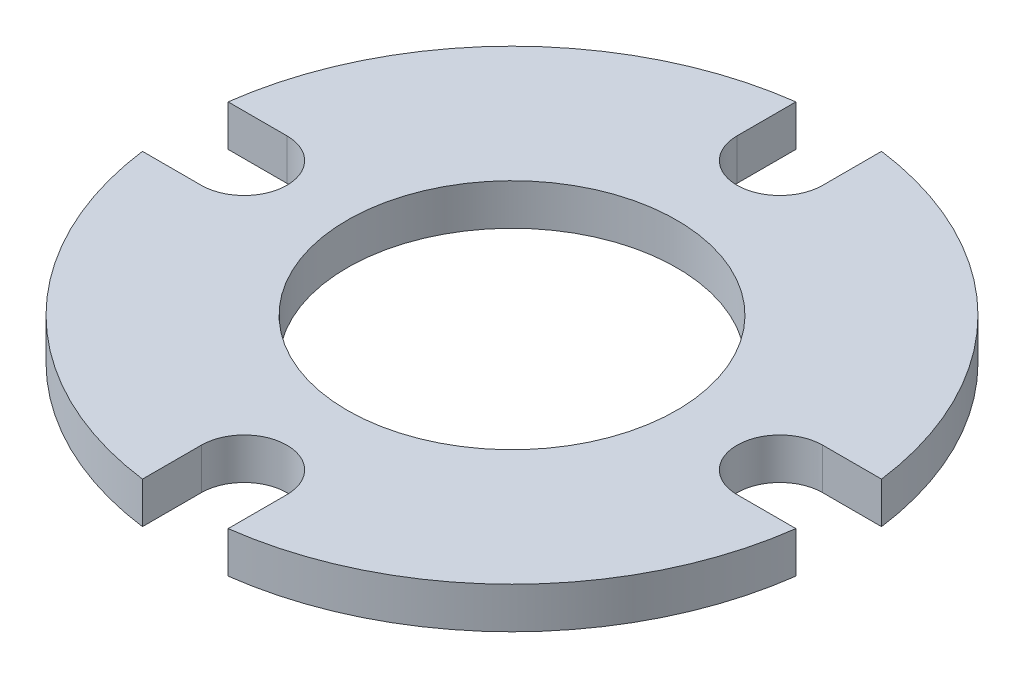
ISO-10303-21;
HEADER;
FILE_DESCRIPTION(('STEP AP214'),'2;1');
FILE_NAME('part.step','',(''),(''),'','','');
FILE_SCHEMA(('AUTOMOTIVE_DESIGN { 1 0 10303 214 1 1 1 1 }'));
ENDSEC;
DATA;
#1=APPLICATION_CONTEXT('core data for automotive mechanical design processes');
#2=APPLICATION_PROTOCOL_DEFINITION('international standard','automotive_design',2000,#1);
#3=PRODUCT_CONTEXT('',#1,'mechanical');
#4=PRODUCT('Part','Part','',(#3));
#5=PRODUCT_RELATED_PRODUCT_CATEGORY('part','',(#4));
#6=PRODUCT_DEFINITION_FORMATION('','',#4);
#7=PRODUCT_DEFINITION_CONTEXT('part definition',#1,'design');
#8=PRODUCT_DEFINITION('design','',#6,#7);
#9=PRODUCT_DEFINITION_SHAPE('','',#8);
#10=(LENGTH_UNIT() NAMED_UNIT(*) SI_UNIT(.MILLI.,.METRE.));
#11=(NAMED_UNIT(*) PLANE_ANGLE_UNIT() SI_UNIT($,.RADIAN.));
#12=(NAMED_UNIT(*) SI_UNIT($,.STERADIAN.) SOLID_ANGLE_UNIT());
#13=UNCERTAINTY_MEASURE_WITH_UNIT(LENGTH_MEASURE(1.E-05),#10,'distance_accuracy_value','');
#14=(GEOMETRIC_REPRESENTATION_CONTEXT(3) GLOBAL_UNCERTAINTY_ASSIGNED_CONTEXT((#13)) GLOBAL_UNIT_ASSIGNED_CONTEXT((#10,
#11,#12)) REPRESENTATION_CONTEXT('',''));
#15=CARTESIAN_POINT('',(0.,0.,0.));
#16=DIRECTION('',(0.,0.,1.));
#17=DIRECTION('',(1.,0.,0.));
#18=AXIS2_PLACEMENT_3D('',#15,#16,#17);
#19=CARTESIAN_POINT('',(0.,0.0625,0.));
#20=DIRECTION('',(0.,1.,0.));
#21=DIRECTION('',(0.,0.,1.));
#22=AXIS2_PLACEMENT_3D('',#19,#20,#21);
#23=PLANE('',#22);
#24=DIRECTION('',(0.,0.,-1.));
#25=VECTOR('',#24,1.);
#26=CARTESIAN_POINT('',(-0.129999999999991,0.0625,-0.813000000000001));
#27=LINE('',#26,#25);
#28=CARTESIAN_POINT('',(-0.129999999999991,0.0625,-0.813000000000001));
#29=VERTEX_POINT('',#28);
#30=CARTESIAN_POINT('',(-0.129999999999989,0.0625,-0.991513993849811));
#31=VERTEX_POINT('',#30);
#32=EDGE_CURVE('E277',#29,#31,#27,.T.);
#33=ORIENTED_EDGE('',*,*,#32,.T.);
#34=CARTESIAN_POINT('',(0.,0.0625,0.));
#35=DIRECTION('',(0.,1.,0.));
#36=DIRECTION('',(0.,0.,1.));
#37=AXIS2_PLACEMENT_3D('',#34,#35,#36);
#38=CIRCLE('',#37,1.);
#39=CARTESIAN_POINT('',(-0.991513993849809,0.0625,-0.130000000000008));
#40=VERTEX_POINT('',#39);
#41=EDGE_CURVE('E167',#31,#40,#38,.T.);
#42=ORIENTED_EDGE('',*,*,#41,.T.);
#43=DIRECTION('',(-1.,0.,0.));
#44=VECTOR('',#43,1.);
#45=CARTESIAN_POINT('',(-0.812999999999999,0.0625,-0.130000000000006));
#46=LINE('',#45,#44);
#47=CARTESIAN_POINT('',(-0.812999999999999,0.0625,-0.130000000000006));
#48=VERTEX_POINT('',#47);
#49=EDGE_CURVE('E307',#48,#40,#46,.T.);
#50=ORIENTED_EDGE('',*,*,#49,.F.);
#51=CARTESIAN_POINT('',(-0.813,0.0625,0.));
#52=DIRECTION('',(0.,1.,0.));
#53=DIRECTION('',(0.,0.,1.));
#54=AXIS2_PLACEMENT_3D('',#51,#52,#53);
#55=CIRCLE('',#54,0.13);
#56=CARTESIAN_POINT('',(-0.813000000000001,0.0625,0.129999999999994));
#57=VERTEX_POINT('',#56);
#58=EDGE_CURVE('E321',#57,#48,#55,.T.);
#59=ORIENTED_EDGE('',*,*,#58,.F.);
#60=DIRECTION('',(-1.,0.,0.));
#61=VECTOR('',#60,1.);
#62=CARTESIAN_POINT('',(-0.813000000000001,0.0625,0.129999999999994));
#63=LINE('',#62,#61);
#64=CARTESIAN_POINT('',(-0.99151399384981,0.0625,0.129999999999993));
#65=VERTEX_POINT('',#64);
#66=EDGE_CURVE('E323',#57,#65,#63,.T.);
#67=ORIENTED_EDGE('',*,*,#66,.T.);
#68=CARTESIAN_POINT('',(0.,0.0625,0.));
#69=DIRECTION('',(0.,1.,0.));
#70=DIRECTION('',(0.,0.,1.));
#71=AXIS2_PLACEMENT_3D('',#68,#69,#70);
#72=CIRCLE('',#71,1.);
#73=CARTESIAN_POINT('',(-0.130000000000004,0.0625,0.991513993849809));
#74=VERTEX_POINT('',#73);
#75=EDGE_CURVE('E329',#65,#74,#72,.T.);
#76=ORIENTED_EDGE('',*,*,#75,.T.);
#77=DIRECTION('',(0.,0.,1.));
#78=VECTOR('',#77,1.);
#79=CARTESIAN_POINT('',(-0.130000000000003,0.0625,0.813));
#80=LINE('',#79,#78);
#81=CARTESIAN_POINT('',(-0.130000000000003,0.0625,0.813));
#82=VERTEX_POINT('',#81);
#83=EDGE_CURVE('E331',#82,#74,#80,.T.);
#84=ORIENTED_EDGE('',*,*,#83,.F.);
#85=CARTESIAN_POINT('',(0.,0.0625,0.813));
#86=DIRECTION('',(0.,1.,0.));
#87=DIRECTION('',(0.,0.,1.));
#88=AXIS2_PLACEMENT_3D('',#85,#86,#87);
#89=CIRCLE('',#88,0.13);
#90=CARTESIAN_POINT('',(0.129999999999997,0.0625,0.813000000000001));
#91=VERTEX_POINT('',#90);
#92=EDGE_CURVE('E334',#91,#82,#89,.T.);
#93=ORIENTED_EDGE('',*,*,#92,.F.);
#94=DIRECTION('',(0.,0.,1.));
#95=VECTOR('',#94,1.);
#96=CARTESIAN_POINT('',(0.129999999999997,0.0625,0.813000000000001));
#97=LINE('',#96,#95);
#98=CARTESIAN_POINT('',(0.129999999999996,0.0625,0.99151399384981));
#99=VERTEX_POINT('',#98);
#100=EDGE_CURVE('E337',#91,#99,#97,.T.);
#101=ORIENTED_EDGE('',*,*,#100,.T.);
#102=CARTESIAN_POINT('',(0.,0.0625,0.));
#103=DIRECTION('',(0.,1.,0.));
#104=DIRECTION('',(0.,0.,1.));
#105=AXIS2_PLACEMENT_3D('',#102,#103,#104);
#106=CIRCLE('',#105,1.);
#107=CARTESIAN_POINT('',(0.991513993849809,0.0625,0.13));
#108=VERTEX_POINT('',#107);
#109=EDGE_CURVE('E339',#99,#108,#106,.T.);
#110=ORIENTED_EDGE('',*,*,#109,.T.);
#111=DIRECTION('',(1.,0.,0.));
#112=VECTOR('',#111,1.);
#113=CARTESIAN_POINT('',(0.813,0.0625,0.13));
#114=LINE('',#113,#112);
#115=CARTESIAN_POINT('',(0.813,0.0625,0.13));
#116=VERTEX_POINT('',#115);
#117=EDGE_CURVE('E341',#116,#108,#114,.T.);
#118=ORIENTED_EDGE('',*,*,#117,.F.);
#119=CARTESIAN_POINT('',(0.813,0.0625,0.));
#120=DIRECTION('',(0.,1.,0.));
#121=DIRECTION('',(0.,0.,1.));
#122=AXIS2_PLACEMENT_3D('',#119,#120,#121);
#123=CIRCLE('',#122,0.13);
#124=CARTESIAN_POINT('',(0.813,0.0625,-0.13));
#125=VERTEX_POINT('',#124);
#126=EDGE_CURVE('E344',#125,#116,#123,.T.);
#127=ORIENTED_EDGE('',*,*,#126,.F.);
#128=DIRECTION('',(1.,0.,0.));
#129=VECTOR('',#128,1.);
#130=CARTESIAN_POINT('',(0.813,0.0625,-0.13));
#131=LINE('',#130,#129);
#132=CARTESIAN_POINT('',(0.991513993849809,0.0625,-0.13));
#133=VERTEX_POINT('',#132);
#134=EDGE_CURVE('E215',#125,#133,#131,.T.);
#135=ORIENTED_EDGE('',*,*,#134,.T.);
#136=CARTESIAN_POINT('',(0.,0.0625,0.));
#137=DIRECTION('',(0.,1.,0.));
#138=DIRECTION('',(0.,0.,1.));
#139=AXIS2_PLACEMENT_3D('',#136,#137,#138);
#140=CIRCLE('',#139,1.);
#141=CARTESIAN_POINT('',(0.130000000000011,0.0625,-0.991513993849808));
#142=VERTEX_POINT('',#141);
#143=EDGE_CURVE('E207',#133,#142,#140,.T.);
#144=ORIENTED_EDGE('',*,*,#143,.T.);
#145=DIRECTION('',(0.,0.,-1.));
#146=VECTOR('',#145,1.);
#147=CARTESIAN_POINT('',(0.130000000000009,0.0625,-0.812999999999999));
#148=LINE('',#147,#146);
#149=CARTESIAN_POINT('',(0.130000000000009,0.0625,-0.812999999999999));
#150=VERTEX_POINT('',#149);
#151=EDGE_CURVE('E212',#150,#142,#148,.T.);
#152=ORIENTED_EDGE('',*,*,#151,.F.);
#153=CARTESIAN_POINT('',(0.,0.0625,-0.813));
#154=DIRECTION('',(0.,1.,0.));
#155=DIRECTION('',(0.,0.,1.));
#156=AXIS2_PLACEMENT_3D('',#153,#154,#155);
#157=CIRCLE('',#156,0.13);
#158=EDGE_CURVE('E230',#29,#150,#157,.T.);
#159=ORIENTED_EDGE('',*,*,#158,.F.);
#160=EDGE_LOOP('',(#33,#42,#50,#59,#67,#76,#84,#93,#101,#110,#118,#127,#135,#144,#152,#159));
#161=FACE_BOUND('',#160,.T.);
#162=CARTESIAN_POINT('',(0.,0.0625,0.));
#163=DIRECTION('',(0.,1.,0.));
#164=DIRECTION('',(0.,0.,1.));
#165=AXIS2_PLACEMENT_3D('',#162,#163,#164);
#166=CIRCLE('',#165,0.5);
#167=CARTESIAN_POINT('',(0.,0.0625,0.5));
#168=VERTEX_POINT('',#167);
#169=EDGE_CURVE('E238',#168,#168,#166,.T.);
#170=ORIENTED_EDGE('',*,*,#169,.F.);
#171=EDGE_LOOP('',(#170));
#172=FACE_BOUND('',#171,.T.);
#173=ADVANCED_FACE('F88',(#161,#172),#23,.T.);
#174=CARTESIAN_POINT('',(0.,-0.0625,0.));
#175=DIRECTION('',(0.,1.,0.));
#176=DIRECTION('',(0.,0.,1.));
#177=AXIS2_PLACEMENT_3D('',#174,#175,#176);
#178=PLANE('',#177);
#179=DIRECTION('',(0.,0.,-1.));
#180=VECTOR('',#179,1.);
#181=CARTESIAN_POINT('',(-0.129999999999991,-0.0625,-0.813000000000001));
#182=LINE('',#181,#180);
#183=CARTESIAN_POINT('',(-0.129999999999991,-0.0625,-0.813000000000001));
#184=VERTEX_POINT('',#183);
#185=CARTESIAN_POINT('',(-0.129999999999989,-0.0625,-0.991513993849811));
#186=VERTEX_POINT('',#185);
#187=EDGE_CURVE('E235',#184,#186,#182,.T.);
#188=ORIENTED_EDGE('',*,*,#187,.F.);
#189=CARTESIAN_POINT('',(0.,-0.0625,-0.813));
#190=DIRECTION('',(0.,1.,0.));
#191=DIRECTION('',(0.,0.,1.));
#192=AXIS2_PLACEMENT_3D('',#189,#190,#191);
#193=CIRCLE('',#192,0.13);
#194=CARTESIAN_POINT('',(0.130000000000009,-0.0625,-0.812999999999999));
#195=VERTEX_POINT('',#194);
#196=EDGE_CURVE('E274',#184,#195,#193,.T.);
#197=ORIENTED_EDGE('',*,*,#196,.T.);
#198=DIRECTION('',(0.,0.,-1.));
#199=VECTOR('',#198,1.);
#200=CARTESIAN_POINT('',(0.130000000000009,-0.0625,-0.812999999999999));
#201=LINE('',#200,#199);
#202=CARTESIAN_POINT('',(0.130000000000011,-0.0625,-0.991513993849808));
#203=VERTEX_POINT('',#202);
#204=EDGE_CURVE('E272',#195,#203,#201,.T.);
#205=ORIENTED_EDGE('',*,*,#204,.T.);
#206=CARTESIAN_POINT('',(0.,-0.0625,0.));
#207=DIRECTION('',(0.,1.,0.));
#208=DIRECTION('',(0.,0.,1.));
#209=AXIS2_PLACEMENT_3D('',#206,#207,#208);
#210=CIRCLE('',#209,1.);
#211=CARTESIAN_POINT('',(0.991513993849809,-0.0625,-0.13));
#212=VERTEX_POINT('',#211);
#213=EDGE_CURVE('E224',#212,#203,#210,.T.);
#214=ORIENTED_EDGE('',*,*,#213,.F.);
#215=DIRECTION('',(1.,0.,0.));
#216=VECTOR('',#215,1.);
#217=CARTESIAN_POINT('',(0.813,-0.0625,-0.13));
#218=LINE('',#217,#216);
#219=CARTESIAN_POINT('',(0.813,-0.0625,-0.13));
#220=VERTEX_POINT('',#219);
#221=EDGE_CURVE('E269',#220,#212,#218,.T.);
#222=ORIENTED_EDGE('',*,*,#221,.F.);
#223=CARTESIAN_POINT('',(0.813,-0.0625,0.));
#224=DIRECTION('',(0.,1.,0.));
#225=DIRECTION('',(0.,0.,1.));
#226=AXIS2_PLACEMENT_3D('',#223,#224,#225);
#227=CIRCLE('',#226,0.13);
#228=CARTESIAN_POINT('',(0.813,-0.0625,0.13));
#229=VERTEX_POINT('',#228);
#230=EDGE_CURVE('E266',#220,#229,#227,.T.);
#231=ORIENTED_EDGE('',*,*,#230,.T.);
#232=DIRECTION('',(1.,0.,0.));
#233=VECTOR('',#232,1.);
#234=CARTESIAN_POINT('',(0.813,-0.0625,0.13));
#235=LINE('',#234,#233);
#236=CARTESIAN_POINT('',(0.991513993849809,-0.0625,0.13));
#237=VERTEX_POINT('',#236);
#238=EDGE_CURVE('E263',#229,#237,#235,.T.);
#239=ORIENTED_EDGE('',*,*,#238,.T.);
#240=CARTESIAN_POINT('',(0.,-0.0625,0.));
#241=DIRECTION('',(0.,1.,0.));
#242=DIRECTION('',(0.,0.,1.));
#243=AXIS2_PLACEMENT_3D('',#240,#241,#242);
#244=CIRCLE('',#243,1.);
#245=CARTESIAN_POINT('',(0.129999999999996,-0.0625,0.99151399384981));
#246=VERTEX_POINT('',#245);
#247=EDGE_CURVE('E260',#246,#237,#244,.T.);
#248=ORIENTED_EDGE('',*,*,#247,.F.);
#249=DIRECTION('',(0.,0.,1.));
#250=VECTOR('',#249,1.);
#251=CARTESIAN_POINT('',(0.129999999999997,-0.0625,0.813000000000001));
#252=LINE('',#251,#250);
#253=CARTESIAN_POINT('',(0.129999999999997,-0.0625,0.813000000000001));
#254=VERTEX_POINT('',#253);
#255=EDGE_CURVE('E258',#254,#246,#252,.T.);
#256=ORIENTED_EDGE('',*,*,#255,.F.);
#257=CARTESIAN_POINT('',(0.,-0.0625,0.813));
#258=DIRECTION('',(0.,1.,0.));
#259=DIRECTION('',(0.,0.,1.));
#260=AXIS2_PLACEMENT_3D('',#257,#258,#259);
#261=CIRCLE('',#260,0.13);
#262=CARTESIAN_POINT('',(-0.130000000000003,-0.0625,0.813));
#263=VERTEX_POINT('',#262);
#264=EDGE_CURVE('E255',#254,#263,#261,.T.);
#265=ORIENTED_EDGE('',*,*,#264,.T.);
#266=DIRECTION('',(0.,0.,1.));
#267=VECTOR('',#266,1.);
#268=CARTESIAN_POINT('',(-0.130000000000003,-0.0625,0.813));
#269=LINE('',#268,#267);
#270=CARTESIAN_POINT('',(-0.130000000000004,-0.0625,0.991513993849809));
#271=VERTEX_POINT('',#270);
#272=EDGE_CURVE('E252',#263,#271,#269,.T.);
#273=ORIENTED_EDGE('',*,*,#272,.T.);
#274=CARTESIAN_POINT('',(0.,-0.0625,0.));
#275=DIRECTION('',(0.,1.,0.));
#276=DIRECTION('',(0.,0.,1.));
#277=AXIS2_PLACEMENT_3D('',#274,#275,#276);
#278=CIRCLE('',#277,1.);
#279=CARTESIAN_POINT('',(-0.99151399384981,-0.0625,0.129999999999993));
#280=VERTEX_POINT('',#279);
#281=EDGE_CURVE('E249',#280,#271,#278,.T.);
#282=ORIENTED_EDGE('',*,*,#281,.F.);
#283=DIRECTION('',(-1.,0.,0.));
#284=VECTOR('',#283,1.);
#285=CARTESIAN_POINT('',(-0.813000000000001,-0.0625,0.129999999999994));
#286=LINE('',#285,#284);
#287=CARTESIAN_POINT('',(-0.813000000000001,-0.0625,0.129999999999994));
#288=VERTEX_POINT('',#287);
#289=EDGE_CURVE('E247',#288,#280,#286,.T.);
#290=ORIENTED_EDGE('',*,*,#289,.F.);
#291=CARTESIAN_POINT('',(-0.813,-0.0625,0.));
#292=DIRECTION('',(0.,1.,0.));
#293=DIRECTION('',(0.,0.,1.));
#294=AXIS2_PLACEMENT_3D('',#291,#292,#293);
#295=CIRCLE('',#294,0.13);
#296=CARTESIAN_POINT('',(-0.812999999999999,-0.0625,-0.130000000000006));
#297=VERTEX_POINT('',#296);
#298=EDGE_CURVE('E244',#288,#297,#295,.T.);
#299=ORIENTED_EDGE('',*,*,#298,.T.);
#300=DIRECTION('',(-1.,0.,0.));
#301=VECTOR('',#300,1.);
#302=CARTESIAN_POINT('',(-0.812999999999999,-0.0625,-0.130000000000006));
#303=LINE('',#302,#301);
#304=CARTESIAN_POINT('',(-0.991513993849809,-0.0625,-0.130000000000008));
#305=VERTEX_POINT('',#304);
#306=EDGE_CURVE('E241',#297,#305,#303,.T.);
#307=ORIENTED_EDGE('',*,*,#306,.T.);
#308=CARTESIAN_POINT('',(0.,-0.0625,0.));
#309=DIRECTION('',(0.,1.,0.));
#310=DIRECTION('',(0.,0.,1.));
#311=AXIS2_PLACEMENT_3D('',#308,#309,#310);
#312=CIRCLE('',#311,1.);
#313=EDGE_CURVE('E237',#186,#305,#312,.T.);
#314=ORIENTED_EDGE('',*,*,#313,.F.);
#315=EDGE_LOOP('',(#188,#197,#205,#214,#222,#231,#239,#248,#256,#265,#273,#282,#290,#299,#307,#314));
#316=FACE_BOUND('',#315,.T.);
#317=CARTESIAN_POINT('',(0.,-0.0625,0.));
#318=DIRECTION('',(0.,1.,0.));
#319=DIRECTION('',(0.,0.,1.));
#320=AXIS2_PLACEMENT_3D('',#317,#318,#319);
#321=CIRCLE('',#320,0.5);
#322=CARTESIAN_POINT('',(0.,-0.0625,0.5));
#323=VERTEX_POINT('',#322);
#324=EDGE_CURVE('E563',#323,#323,#321,.T.);
#325=ORIENTED_EDGE('',*,*,#324,.T.);
#326=EDGE_LOOP('',(#325));
#327=FACE_BOUND('',#326,.T.);
#328=ADVANCED_FACE('F311',(#316,#327),#178,.F.);
#329=CARTESIAN_POINT('',(-0.129999999999991,0.0625,-0.813000000000001));
#330=DIRECTION('',(-1.,0.,0.));
#331=DIRECTION('',(0.,0.,1.));
#332=AXIS2_PLACEMENT_3D('',#329,#330,#331);
#333=PLANE('',#332);
#334=ORIENTED_EDGE('',*,*,#187,.T.);
#335=DIRECTION('',(0.,-1.,0.));
#336=VECTOR('',#335,1.);
#337=CARTESIAN_POINT('',(-0.129999999999989,0.0625,-0.991513993849811));
#338=LINE('',#337,#336);
#339=EDGE_CURVE('E12',#31,#186,#338,.T.);
#340=ORIENTED_EDGE('',*,*,#339,.F.);
#341=ORIENTED_EDGE('',*,*,#32,.F.);
#342=DIRECTION('',(0.,-1.,0.));
#343=VECTOR('',#342,1.);
#344=CARTESIAN_POINT('',(-0.129999999999991,0.0625,-0.813000000000001));
#345=LINE('',#344,#343);
#346=EDGE_CURVE('E105',#29,#184,#345,.T.);
#347=ORIENTED_EDGE('',*,*,#346,.T.);
#348=EDGE_LOOP('',(#334,#340,#341,#347));
#349=FACE_BOUND('',#348,.T.);
#350=ADVANCED_FACE('F90',(#349),#333,.F.);
#351=CARTESIAN_POINT('',(0.,0.0625,0.));
#352=DIRECTION('',(0.,-1.,0.));
#353=DIRECTION('',(0.,0.,-1.));
#354=AXIS2_PLACEMENT_3D('',#351,#352,#353);
#355=CYLINDRICAL_SURFACE('',#354,1.);
#356=ORIENTED_EDGE('',*,*,#313,.T.);
#357=DIRECTION('',(0.,-1.,0.));
#358=VECTOR('',#357,1.);
#359=CARTESIAN_POINT('',(-0.991513993849809,0.0625,-0.130000000000008));
#360=LINE('',#359,#358);
#361=EDGE_CURVE('E97',#40,#305,#360,.T.);
#362=ORIENTED_EDGE('',*,*,#361,.F.);
#363=ORIENTED_EDGE('',*,*,#41,.F.);
#364=ORIENTED_EDGE('',*,*,#339,.T.);
#365=EDGE_LOOP('',(#356,#362,#363,#364));
#366=FACE_BOUND('',#365,.T.);
#367=ADVANCED_FACE('F308',(#366),#355,.T.);
#368=CARTESIAN_POINT('',(-0.812999999999999,0.0625,-0.130000000000006));
#369=DIRECTION('',(0.,0.,1.));
#370=DIRECTION('',(1.,0.,0.));
#371=AXIS2_PLACEMENT_3D('',#368,#369,#370);
#372=PLANE('',#371);
#373=ORIENTED_EDGE('',*,*,#306,.F.);
#374=DIRECTION('',(0.,-1.,0.));
#375=VECTOR('',#374,1.);
#376=CARTESIAN_POINT('',(-0.812999999999999,0.0625,-0.130000000000006));
#377=LINE('',#376,#375);
#378=EDGE_CURVE('E301',#48,#297,#377,.T.);
#379=ORIENTED_EDGE('',*,*,#378,.F.);
#380=ORIENTED_EDGE('',*,*,#49,.T.);
#381=ORIENTED_EDGE('',*,*,#361,.T.);
#382=EDGE_LOOP('',(#373,#379,#380,#381));
#383=FACE_BOUND('',#382,.T.);
#384=ADVANCED_FACE('F305',(#383),#372,.T.);
#385=CARTESIAN_POINT('',(-0.813,0.0625,0.));
#386=DIRECTION('',(0.,-1.,0.));
#387=DIRECTION('',(0.,0.,-1.));
#388=AXIS2_PLACEMENT_3D('',#385,#386,#387);
#389=CYLINDRICAL_SURFACE('',#388,0.13);
#390=ORIENTED_EDGE('',*,*,#298,.F.);
#391=DIRECTION('',(0.,-1.,0.));
#392=VECTOR('',#391,1.);
#393=CARTESIAN_POINT('',(-0.813000000000001,0.0625,0.129999999999994));
#394=LINE('',#393,#392);
#395=EDGE_CURVE('E299',#57,#288,#394,.T.);
#396=ORIENTED_EDGE('',*,*,#395,.F.);
#397=ORIENTED_EDGE('',*,*,#58,.T.);
#398=ORIENTED_EDGE('',*,*,#378,.T.);
#399=EDGE_LOOP('',(#390,#396,#397,#398));
#400=FACE_BOUND('',#399,.T.);
#401=ADVANCED_FACE('F317',(#400),#389,.F.);
#402=CARTESIAN_POINT('',(-0.813000000000001,0.0625,0.129999999999994));
#403=DIRECTION('',(0.,0.,1.));
#404=DIRECTION('',(1.,0.,0.));
#405=AXIS2_PLACEMENT_3D('',#402,#403,#404);
#406=PLANE('',#405);
#407=ORIENTED_EDGE('',*,*,#289,.T.);
#408=DIRECTION('',(0.,-1.,0.));
#409=VECTOR('',#408,1.);
#410=CARTESIAN_POINT('',(-0.99151399384981,0.0625,0.129999999999993));
#411=LINE('',#410,#409);
#412=EDGE_CURVE('E296',#65,#280,#411,.T.);
#413=ORIENTED_EDGE('',*,*,#412,.F.);
#414=ORIENTED_EDGE('',*,*,#66,.F.);
#415=ORIENTED_EDGE('',*,*,#395,.T.);
#416=EDGE_LOOP('',(#407,#413,#414,#415));
#417=FACE_BOUND('',#416,.T.);
#418=ADVANCED_FACE('F488',(#417),#406,.F.);
#419=CARTESIAN_POINT('',(0.,0.0625,0.));
#420=DIRECTION('',(0.,-1.,0.));
#421=DIRECTION('',(0.,0.,-1.));
#422=AXIS2_PLACEMENT_3D('',#419,#420,#421);
#423=CYLINDRICAL_SURFACE('',#422,1.);
#424=ORIENTED_EDGE('',*,*,#281,.T.);
#425=DIRECTION('',(0.,-1.,0.));
#426=VECTOR('',#425,1.);
#427=CARTESIAN_POINT('',(-0.130000000000004,0.0625,0.991513993849809));
#428=LINE('',#427,#426);
#429=EDGE_CURVE('E294',#74,#271,#428,.T.);
#430=ORIENTED_EDGE('',*,*,#429,.F.);
#431=ORIENTED_EDGE('',*,*,#75,.F.);
#432=ORIENTED_EDGE('',*,*,#412,.T.);
#433=EDGE_LOOP('',(#424,#430,#431,#432));
#434=FACE_BOUND('',#433,.T.);
#435=ADVANCED_FACE('F477',(#434),#423,.T.);
#436=CARTESIAN_POINT('',(-0.130000000000003,0.0625,0.813));
#437=DIRECTION('',(1.,0.,0.));
#438=DIRECTION('',(0.,0.,-1.));
#439=AXIS2_PLACEMENT_3D('',#436,#437,#438);
#440=PLANE('',#439);
#441=ORIENTED_EDGE('',*,*,#272,.F.);
#442=DIRECTION('',(0.,-1.,0.));
#443=VECTOR('',#442,1.);
#444=CARTESIAN_POINT('',(-0.130000000000003,0.0625,0.813));
#445=LINE('',#444,#443);
#446=EDGE_CURVE('E292',#82,#263,#445,.T.);
#447=ORIENTED_EDGE('',*,*,#446,.F.);
#448=ORIENTED_EDGE('',*,*,#83,.T.);
#449=ORIENTED_EDGE('',*,*,#429,.T.);
#450=EDGE_LOOP('',(#441,#447,#448,#449));
#451=FACE_BOUND('',#450,.T.);
#452=ADVANCED_FACE('F466',(#451),#440,.T.);
#453=CARTESIAN_POINT('',(0.,0.0625,0.813));
#454=DIRECTION('',(0.,-1.,0.));
#455=DIRECTION('',(0.,0.,-1.));
#456=AXIS2_PLACEMENT_3D('',#453,#454,#455);
#457=CYLINDRICAL_SURFACE('',#456,0.13);
#458=ORIENTED_EDGE('',*,*,#264,.F.);
#459=DIRECTION('',(0.,-1.,0.));
#460=VECTOR('',#459,1.);
#461=CARTESIAN_POINT('',(0.129999999999997,0.0625,0.813000000000001));
#462=LINE('',#461,#460);
#463=EDGE_CURVE('E290',#91,#254,#462,.T.);
#464=ORIENTED_EDGE('',*,*,#463,.F.);
#465=ORIENTED_EDGE('',*,*,#92,.T.);
#466=ORIENTED_EDGE('',*,*,#446,.T.);
#467=EDGE_LOOP('',(#458,#464,#465,#466));
#468=FACE_BOUND('',#467,.T.);
#469=ADVANCED_FACE('F455',(#468),#457,.F.);
#470=CARTESIAN_POINT('',(0.129999999999997,0.0625,0.813000000000001));
#471=DIRECTION('',(1.,0.,0.));
#472=DIRECTION('',(0.,0.,-1.));
#473=AXIS2_PLACEMENT_3D('',#470,#471,#472);
#474=PLANE('',#473);
#475=ORIENTED_EDGE('',*,*,#255,.T.);
#476=DIRECTION('',(0.,-1.,0.));
#477=VECTOR('',#476,1.);
#478=CARTESIAN_POINT('',(0.129999999999996,0.0625,0.99151399384981));
#479=LINE('',#478,#477);
#480=EDGE_CURVE('E287',#99,#246,#479,.T.);
#481=ORIENTED_EDGE('',*,*,#480,.F.);
#482=ORIENTED_EDGE('',*,*,#100,.F.);
#483=ORIENTED_EDGE('',*,*,#463,.T.);
#484=EDGE_LOOP('',(#475,#481,#482,#483));
#485=FACE_BOUND('',#484,.T.);
#486=ADVANCED_FACE('F444',(#485),#474,.F.);
#487=CARTESIAN_POINT('',(0.,0.0625,0.));
#488=DIRECTION('',(0.,-1.,0.));
#489=DIRECTION('',(0.,0.,-1.));
#490=AXIS2_PLACEMENT_3D('',#487,#488,#489);
#491=CYLINDRICAL_SURFACE('',#490,1.);
#492=ORIENTED_EDGE('',*,*,#247,.T.);
#493=DIRECTION('',(0.,-1.,0.));
#494=VECTOR('',#493,1.);
#495=CARTESIAN_POINT('',(0.991513993849809,0.0625,0.13));
#496=LINE('',#495,#494);
#497=EDGE_CURVE('E285',#108,#237,#496,.T.);
#498=ORIENTED_EDGE('',*,*,#497,.F.);
#499=ORIENTED_EDGE('',*,*,#109,.F.);
#500=ORIENTED_EDGE('',*,*,#480,.T.);
#501=EDGE_LOOP('',(#492,#498,#499,#500));
#502=FACE_BOUND('',#501,.T.);
#503=ADVANCED_FACE('F434',(#502),#491,.T.);
#504=CARTESIAN_POINT('',(0.813,0.0625,0.13));
#505=DIRECTION('',(0.,0.,-1.));
#506=DIRECTION('',(-1.,0.,0.));
#507=AXIS2_PLACEMENT_3D('',#504,#505,#506);
#508=PLANE('',#507);
#509=ORIENTED_EDGE('',*,*,#238,.F.);
#510=DIRECTION('',(0.,-1.,0.));
#511=VECTOR('',#510,1.);
#512=CARTESIAN_POINT('',(0.813,0.0625,0.13));
#513=LINE('',#512,#511);
#514=EDGE_CURVE('E283',#116,#229,#513,.T.);
#515=ORIENTED_EDGE('',*,*,#514,.F.);
#516=ORIENTED_EDGE('',*,*,#117,.T.);
#517=ORIENTED_EDGE('',*,*,#497,.T.);
#518=EDGE_LOOP('',(#509,#515,#516,#517));
#519=FACE_BOUND('',#518,.T.);
#520=ADVANCED_FACE('F354',(#519),#508,.T.);
#521=CARTESIAN_POINT('',(0.813,0.0625,0.));
#522=DIRECTION('',(0.,-1.,0.));
#523=DIRECTION('',(0.,0.,-1.));
#524=AXIS2_PLACEMENT_3D('',#521,#522,#523);
#525=CYLINDRICAL_SURFACE('',#524,0.13);
#526=ORIENTED_EDGE('',*,*,#230,.F.);
#527=DIRECTION('',(0.,-1.,0.));
#528=VECTOR('',#527,1.);
#529=CARTESIAN_POINT('',(0.813,0.0625,-0.13));
#530=LINE('',#529,#528);
#531=EDGE_CURVE('E281',#125,#220,#530,.T.);
#532=ORIENTED_EDGE('',*,*,#531,.F.);
#533=ORIENTED_EDGE('',*,*,#126,.T.);
#534=ORIENTED_EDGE('',*,*,#514,.T.);
#535=EDGE_LOOP('',(#526,#532,#533,#534));
#536=FACE_BOUND('',#535,.T.);
#537=ADVANCED_FACE('F348',(#536),#525,.F.);
#538=CARTESIAN_POINT('',(0.813,0.0625,-0.13));
#539=DIRECTION('',(0.,0.,-1.));
#540=DIRECTION('',(-1.,0.,0.));
#541=AXIS2_PLACEMENT_3D('',#538,#539,#540);
#542=PLANE('',#541);
#543=ORIENTED_EDGE('',*,*,#221,.T.);
#544=DIRECTION('',(0.,-1.,0.));
#545=VECTOR('',#544,1.);
#546=CARTESIAN_POINT('',(0.991513993849809,0.0625,-0.13));
#547=LINE('',#546,#545);
#548=EDGE_CURVE('E227',#133,#212,#547,.T.);
#549=ORIENTED_EDGE('',*,*,#548,.F.);
#550=ORIENTED_EDGE('',*,*,#134,.F.);
#551=ORIENTED_EDGE('',*,*,#531,.T.);
#552=EDGE_LOOP('',(#543,#549,#550,#551));
#553=FACE_BOUND('',#552,.T.);
#554=ADVANCED_FACE('F358',(#553),#542,.F.);
#555=CARTESIAN_POINT('',(0.,0.0625,0.));
#556=DIRECTION('',(0.,-1.,0.));
#557=DIRECTION('',(0.,0.,-1.));
#558=AXIS2_PLACEMENT_3D('',#555,#556,#557);
#559=CYLINDRICAL_SURFACE('',#558,1.);
#560=ORIENTED_EDGE('',*,*,#213,.T.);
#561=DIRECTION('',(0.,-1.,0.));
#562=VECTOR('',#561,1.);
#563=CARTESIAN_POINT('',(0.130000000000011,0.0625,-0.991513993849808));
#564=LINE('',#563,#562);
#565=EDGE_CURVE('E221',#142,#203,#564,.T.);
#566=ORIENTED_EDGE('',*,*,#565,.F.);
#567=ORIENTED_EDGE('',*,*,#143,.F.);
#568=ORIENTED_EDGE('',*,*,#548,.T.);
#569=EDGE_LOOP('',(#560,#566,#567,#568));
#570=FACE_BOUND('',#569,.T.);
#571=ADVANCED_FACE('F222',(#570),#559,.T.);
#572=CARTESIAN_POINT('',(0.130000000000009,0.0625,-0.812999999999999));
#573=DIRECTION('',(-1.,0.,0.));
#574=DIRECTION('',(0.,0.,1.));
#575=AXIS2_PLACEMENT_3D('',#572,#573,#574);
#576=PLANE('',#575);
#577=ORIENTED_EDGE('',*,*,#204,.F.);
#578=DIRECTION('',(0.,-1.,0.));
#579=VECTOR('',#578,1.);
#580=CARTESIAN_POINT('',(0.130000000000009,0.0625,-0.812999999999999));
#581=LINE('',#580,#579);
#582=EDGE_CURVE('E155',#150,#195,#581,.T.);
#583=ORIENTED_EDGE('',*,*,#582,.F.);
#584=ORIENTED_EDGE('',*,*,#151,.T.);
#585=ORIENTED_EDGE('',*,*,#565,.T.);
#586=EDGE_LOOP('',(#577,#583,#584,#585));
#587=FACE_BOUND('',#586,.T.);
#588=ADVANCED_FACE('F229',(#587),#576,.T.);
#589=CARTESIAN_POINT('',(0.,0.0625,-0.813));
#590=DIRECTION('',(0.,-1.,0.));
#591=DIRECTION('',(0.,0.,-1.));
#592=AXIS2_PLACEMENT_3D('',#589,#590,#591);
#593=CYLINDRICAL_SURFACE('',#592,0.13);
#594=ORIENTED_EDGE('',*,*,#196,.F.);
#595=ORIENTED_EDGE('',*,*,#346,.F.);
#596=ORIENTED_EDGE('',*,*,#158,.T.);
#597=ORIENTED_EDGE('',*,*,#582,.T.);
#598=EDGE_LOOP('',(#594,#595,#596,#597));
#599=FACE_BOUND('',#598,.T.);
#600=ADVANCED_FACE('F376',(#599),#593,.F.);
#601=CARTESIAN_POINT('',(0.,0.0625,0.));
#602=DIRECTION('',(0.,-1.,0.));
#603=DIRECTION('',(0.,0.,-1.));
#604=AXIS2_PLACEMENT_3D('',#601,#602,#603);
#605=CYLINDRICAL_SURFACE('',#604,0.5);
#606=ORIENTED_EDGE('',*,*,#169,.T.);
#607=EDGE_LOOP('',(#606));
#608=FACE_BOUND('',#607,.T.);
#609=ORIENTED_EDGE('',*,*,#324,.F.);
#610=EDGE_LOOP('',(#609));
#611=FACE_BOUND('',#610,.T.);
#612=ADVANCED_FACE('F374',(#608,#611),#605,.F.);
#613=CLOSED_SHELL('',(#173,#328,#350,#367,#384,#401,#418,#435,#452,#469,#486,#503,#520,#537,
#554,#571,#588,#600,#612));
#614=MANIFOLD_SOLID_BREP('B2',#613);
#615=ADVANCED_BREP_SHAPE_REPRESENTATION('',(#18,#614),#14);
#616=SHAPE_DEFINITION_REPRESENTATION(#9,#615);
ENDSEC;
END-ISO-10303-21;
